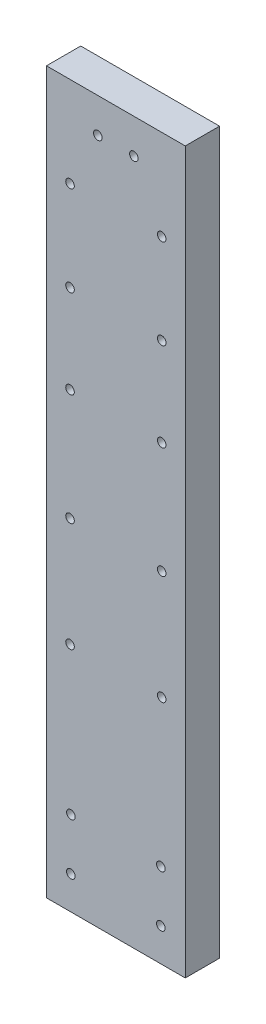
ISO-10303-21;
HEADER;
FILE_DESCRIPTION(('STEP AP214'),'2;1');
FILE_NAME('part.step','',(''),(''),'','','');
FILE_SCHEMA(('AUTOMOTIVE_DESIGN { 1 0 10303 214 1 1 1 1 }'));
ENDSEC;
DATA;
#1=APPLICATION_CONTEXT('core data for automotive mechanical design processes');
#2=APPLICATION_PROTOCOL_DEFINITION('international standard','automotive_design',2000,#1);
#3=PRODUCT_CONTEXT('',#1,'mechanical');
#4=PRODUCT('Part','Part','',(#3));
#5=PRODUCT_RELATED_PRODUCT_CATEGORY('part','',(#4));
#6=PRODUCT_DEFINITION_FORMATION('','',#4);
#7=PRODUCT_DEFINITION_CONTEXT('part definition',#1,'design');
#8=PRODUCT_DEFINITION('design','',#6,#7);
#9=PRODUCT_DEFINITION_SHAPE('','',#8);
#10=(LENGTH_UNIT() NAMED_UNIT(*) SI_UNIT(.MILLI.,.METRE.));
#11=(NAMED_UNIT(*) PLANE_ANGLE_UNIT() SI_UNIT($,.RADIAN.));
#12=(NAMED_UNIT(*) SI_UNIT($,.STERADIAN.) SOLID_ANGLE_UNIT());
#13=UNCERTAINTY_MEASURE_WITH_UNIT(LENGTH_MEASURE(1.E-05),#10,'distance_accuracy_value','');
#14=(GEOMETRIC_REPRESENTATION_CONTEXT(3) GLOBAL_UNCERTAINTY_ASSIGNED_CONTEXT((#13)) GLOBAL_UNIT_ASSIGNED_CONTEXT((#10,
#11,#12)) REPRESENTATION_CONTEXT('',''));
#15=CARTESIAN_POINT('',(0.,0.,0.));
#16=DIRECTION('',(0.,0.,1.));
#17=DIRECTION('',(1.,0.,0.));
#18=AXIS2_PLACEMENT_3D('',#15,#16,#17);
#19=CARTESIAN_POINT('',(0.,0.,4.));
#20=DIRECTION('',(0.,0.,-1.));
#21=DIRECTION('',(-1.,0.,0.));
#22=AXIS2_PLACEMENT_3D('',#19,#20,#21);
#23=PLANE('',#22);
#24=CARTESIAN_POINT('',(10.2000000000012,80.0650000000017,4.));
#25=DIRECTION('',(0.,0.,1.));
#26=DIRECTION('',(1.,0.,0.));
#27=AXIS2_PLACEMENT_3D('',#24,#25,#26);
#28=CIRCLE('',#27,0.499999999999999);
#29=CARTESIAN_POINT('',(10.7000000000012,80.0650000000017,4.));
#30=VERTEX_POINT('',#29);
#31=EDGE_CURVE('E192',#30,#30,#28,.T.);
#32=ORIENTED_EDGE('',*,*,#31,.F.);
#33=EDGE_LOOP('',(#32));
#34=FACE_BOUND('',#33,.T.);
#35=CARTESIAN_POINT('',(13.4500000000022,73.5649999999973,4.));
#36=DIRECTION('',(0.,0.,1.));
#37=DIRECTION('',(1.,0.,0.));
#38=AXIS2_PLACEMENT_3D('',#35,#36,#37);
#39=CIRCLE('',#38,0.500000000000006);
#40=CARTESIAN_POINT('',(13.9500000000022,73.5649999999973,4.));
#41=VERTEX_POINT('',#40);
#42=EDGE_CURVE('E180',#41,#41,#39,.T.);
#43=ORIENTED_EDGE('',*,*,#42,.F.);
#44=EDGE_LOOP('',(#43));
#45=FACE_BOUND('',#44,.T.);
#46=CARTESIAN_POINT('',(13.350000000001,3.84644883105539,4.));
#47=DIRECTION('',(0.,0.,1.));
#48=DIRECTION('',(-1.,0.,0.));
#49=AXIS2_PLACEMENT_3D('',#46,#47,#48);
#50=CIRCLE('',#49,0.499999999999999);
#51=CARTESIAN_POINT('',(12.850000000001,3.84644883105539,4.));
#52=VERTEX_POINT('',#51);
#53=EDGE_CURVE('E168',#52,#52,#50,.T.);
#54=ORIENTED_EDGE('',*,*,#53,.F.);
#55=EDGE_LOOP('',(#54));
#56=FACE_BOUND('',#55,.T.);
#57=CARTESIAN_POINT('',(2.85,3.84644883105539,4.));
#58=DIRECTION('',(0.,0.,1.));
#59=DIRECTION('',(1.,0.,0.));
#60=AXIS2_PLACEMENT_3D('',#57,#58,#59);
#61=CIRCLE('',#60,0.499999999999999);
#62=CARTESIAN_POINT('',(3.35,3.84644883105539,4.));
#63=VERTEX_POINT('',#62);
#64=EDGE_CURVE('E156',#63,#63,#61,.T.);
#65=ORIENTED_EDGE('',*,*,#64,.F.);
#66=EDGE_LOOP('',(#65));
#67=FACE_BOUND('',#66,.T.);
#68=CARTESIAN_POINT('',(13.4500000000001,63.064999999999,4.));
#69=DIRECTION('',(0.,0.,1.));
#70=DIRECTION('',(1.,0.,0.));
#71=AXIS2_PLACEMENT_3D('',#68,#69,#70);
#72=CIRCLE('',#71,0.500000000000006);
#73=CARTESIAN_POINT('',(13.9500000000001,63.064999999999,4.));
#74=VERTEX_POINT('',#73);
#75=EDGE_CURVE('E144',#74,#74,#72,.T.);
#76=ORIENTED_EDGE('',*,*,#75,.F.);
#77=EDGE_LOOP('',(#76));
#78=FACE_BOUND('',#77,.T.);
#79=CARTESIAN_POINT('',(13.4500000000017,52.739999999999,4.));
#80=DIRECTION('',(0.,0.,1.));
#81=DIRECTION('',(1.,0.,0.));
#82=AXIS2_PLACEMENT_3D('',#79,#80,#81);
#83=CIRCLE('',#82,0.499999999999999);
#84=CARTESIAN_POINT('',(13.9500000000017,52.739999999999,4.));
#85=VERTEX_POINT('',#84);
#86=EDGE_CURVE('E132',#85,#85,#83,.T.);
#87=ORIENTED_EDGE('',*,*,#86,.F.);
#88=EDGE_LOOP('',(#87));
#89=FACE_BOUND('',#88,.T.);
#90=CARTESIAN_POINT('',(13.4500000000001,39.7399999999992,4.));
#91=DIRECTION('',(0.,0.,1.));
#92=DIRECTION('',(1.,0.,0.));
#93=AXIS2_PLACEMENT_3D('',#90,#91,#92);
#94=CIRCLE('',#93,0.499999999999999);
#95=CARTESIAN_POINT('',(13.9500000000001,39.7399999999992,4.));
#96=VERTEX_POINT('',#95);
#97=EDGE_CURVE('E120',#96,#96,#94,.T.);
#98=ORIENTED_EDGE('',*,*,#97,.F.);
#99=EDGE_LOOP('',(#98));
#100=FACE_BOUND('',#99,.T.);
#101=CARTESIAN_POINT('',(13.4500000000001,27.0000000000002,4.));
#102=DIRECTION('',(0.,0.,1.));
#103=DIRECTION('',(1.,0.,0.));
#104=AXIS2_PLACEMENT_3D('',#101,#102,#103);
#105=CIRCLE('',#104,0.499999999999999);
#106=CARTESIAN_POINT('',(13.9500000000001,27.0000000000002,4.));
#107=VERTEX_POINT('',#106);
#108=EDGE_CURVE('E99',#107,#107,#105,.T.);
#109=ORIENTED_EDGE('',*,*,#108,.F.);
#110=EDGE_LOOP('',(#109));
#111=FACE_BOUND('',#110,.T.);
#112=DIRECTION('',(-1.,0.,0.));
#113=VECTOR('',#112,1.);
#114=CARTESIAN_POINT('',(16.2000000000021,84.1,4.));
#115=LINE('',#114,#113);
#116=CARTESIAN_POINT('',(16.2000000000021,84.1,4.));
#117=VERTEX_POINT('',#116);
#118=CARTESIAN_POINT('',(0.,84.1,4.));
#119=VERTEX_POINT('',#118);
#120=EDGE_CURVE('E84',#117,#119,#115,.T.);
#121=ORIENTED_EDGE('',*,*,#120,.T.);
#122=DIRECTION('',(0.,-1.,0.));
#123=VECTOR('',#122,1.);
#124=CARTESIAN_POINT('',(0.,0.,4.));
#125=LINE('',#124,#123);
#126=CARTESIAN_POINT('',(0.,0.,4.));
#127=VERTEX_POINT('',#126);
#128=EDGE_CURVE('E79',#119,#127,#125,.T.);
#129=ORIENTED_EDGE('',*,*,#128,.T.);
#130=DIRECTION('',(1.,0.,0.));
#131=VECTOR('',#130,1.);
#132=CARTESIAN_POINT('',(0.,0.,4.));
#133=LINE('',#132,#131);
#134=CARTESIAN_POINT('',(16.2000000000021,0.,4.));
#135=VERTEX_POINT('',#134);
#136=EDGE_CURVE('E82',#127,#135,#133,.T.);
#137=ORIENTED_EDGE('',*,*,#136,.T.);
#138=DIRECTION('',(0.,1.,0.));
#139=VECTOR('',#138,1.);
#140=CARTESIAN_POINT('',(16.2000000000021,0.,4.));
#141=LINE('',#140,#139);
#142=EDGE_CURVE('E49',#135,#117,#141,.T.);
#143=ORIENTED_EDGE('',*,*,#142,.T.);
#144=EDGE_LOOP('',(#121,#129,#137,#143));
#145=FACE_BOUND('',#144,.T.);
#146=CARTESIAN_POINT('',(2.75000000000004,27.0000000000004,4.));
#147=DIRECTION('',(0.,0.,1.));
#148=DIRECTION('',(1.,0.,0.));
#149=AXIS2_PLACEMENT_3D('',#146,#147,#148);
#150=CIRCLE('',#149,0.499999999999999);
#151=CARTESIAN_POINT('',(3.25000000000004,27.0000000000004,4.));
#152=VERTEX_POINT('',#151);
#153=EDGE_CURVE('E114',#152,#152,#150,.T.);
#154=ORIENTED_EDGE('',*,*,#153,.F.);
#155=EDGE_LOOP('',(#154));
#156=FACE_BOUND('',#155,.T.);
#157=CARTESIAN_POINT('',(2.75000000000003,39.7399999999994,4.));
#158=DIRECTION('',(0.,0.,1.));
#159=DIRECTION('',(1.,0.,0.));
#160=AXIS2_PLACEMENT_3D('',#157,#158,#159);
#161=CIRCLE('',#160,0.499999999999999);
#162=CARTESIAN_POINT('',(3.25000000000003,39.7399999999994,4.));
#163=VERTEX_POINT('',#162);
#164=EDGE_CURVE('E126',#163,#163,#161,.T.);
#165=ORIENTED_EDGE('',*,*,#164,.F.);
#166=EDGE_LOOP('',(#165));
#167=FACE_BOUND('',#166,.T.);
#168=CARTESIAN_POINT('',(2.75000000000138,52.7399999999993,4.));
#169=DIRECTION('',(0.,0.,1.));
#170=DIRECTION('',(1.,0.,0.));
#171=AXIS2_PLACEMENT_3D('',#168,#169,#170);
#172=CIRCLE('',#171,0.499999999999999);
#173=CARTESIAN_POINT('',(3.25000000000138,52.7399999999993,4.));
#174=VERTEX_POINT('',#173);
#175=EDGE_CURVE('E138',#174,#174,#172,.T.);
#176=ORIENTED_EDGE('',*,*,#175,.F.);
#177=EDGE_LOOP('',(#176));
#178=FACE_BOUND('',#177,.T.);
#179=CARTESIAN_POINT('',(2.85,9.84644883105539,4.));
#180=DIRECTION('',(0.,0.,1.));
#181=DIRECTION('',(1.,0.,0.));
#182=AXIS2_PLACEMENT_3D('',#179,#180,#181);
#183=CIRCLE('',#182,0.499999999999999);
#184=CARTESIAN_POINT('',(3.35,9.84644883105539,4.));
#185=VERTEX_POINT('',#184);
#186=EDGE_CURVE('E150',#185,#185,#183,.T.);
#187=ORIENTED_EDGE('',*,*,#186,.F.);
#188=EDGE_LOOP('',(#187));
#189=FACE_BOUND('',#188,.T.);
#190=CARTESIAN_POINT('',(13.350000000001,9.84644883105539,4.));
#191=DIRECTION('',(0.,0.,1.));
#192=DIRECTION('',(-1.,0.,0.));
#193=AXIS2_PLACEMENT_3D('',#190,#191,#192);
#194=CIRCLE('',#193,0.499999999999999);
#195=CARTESIAN_POINT('',(12.850000000001,9.84644883105539,4.));
#196=VERTEX_POINT('',#195);
#197=EDGE_CURVE('E162',#196,#196,#194,.T.);
#198=ORIENTED_EDGE('',*,*,#197,.F.);
#199=EDGE_LOOP('',(#198));
#200=FACE_BOUND('',#199,.T.);
#201=CARTESIAN_POINT('',(2.75000000000004,63.0649999999993,4.));
#202=DIRECTION('',(0.,0.,1.));
#203=DIRECTION('',(1.,0.,0.));
#204=AXIS2_PLACEMENT_3D('',#201,#202,#203);
#205=CIRCLE('',#204,0.499999999999999);
#206=CARTESIAN_POINT('',(3.25000000000004,63.0649999999993,4.));
#207=VERTEX_POINT('',#206);
#208=EDGE_CURVE('E174',#207,#207,#205,.T.);
#209=ORIENTED_EDGE('',*,*,#208,.F.);
#210=EDGE_LOOP('',(#209));
#211=FACE_BOUND('',#210,.T.);
#212=CARTESIAN_POINT('',(2.75000000000093,73.5649999999997,4.));
#213=DIRECTION('',(0.,0.,1.));
#214=DIRECTION('',(1.,0.,0.));
#215=AXIS2_PLACEMENT_3D('',#212,#213,#214);
#216=CIRCLE('',#215,0.499999999999999);
#217=CARTESIAN_POINT('',(3.25000000000093,73.5649999999997,4.));
#218=VERTEX_POINT('',#217);
#219=EDGE_CURVE('E186',#218,#218,#216,.T.);
#220=ORIENTED_EDGE('',*,*,#219,.F.);
#221=EDGE_LOOP('',(#220));
#222=FACE_BOUND('',#221,.T.);
#223=CARTESIAN_POINT('',(6.00000000000112,80.0650000000017,4.));
#224=DIRECTION('',(0.,0.,1.));
#225=DIRECTION('',(1.,0.,0.));
#226=AXIS2_PLACEMENT_3D('',#223,#224,#225);
#227=CIRCLE('',#226,0.499999999999999);
#228=CARTESIAN_POINT('',(6.50000000000111,80.0650000000017,4.));
#229=VERTEX_POINT('',#228);
#230=EDGE_CURVE('E198',#229,#229,#227,.T.);
#231=ORIENTED_EDGE('',*,*,#230,.F.);
#232=EDGE_LOOP('',(#231));
#233=FACE_BOUND('',#232,.T.);
#234=ADVANCED_FACE('F32',(#34,#45,#56,#67,#78,#89,#100,#111,#145,#156,#167,#178,#189,#200,#211,
#222,#233),#23,.F.);
#235=CARTESIAN_POINT('',(0.,0.,0.));
#236=DIRECTION('',(0.,0.,-1.));
#237=DIRECTION('',(-1.,0.,0.));
#238=AXIS2_PLACEMENT_3D('',#235,#236,#237);
#239=PLANE('',#238);
#240=CARTESIAN_POINT('',(10.2000000000012,80.0650000000017,0.));
#241=DIRECTION('',(0.,0.,1.));
#242=DIRECTION('',(1.,0.,0.));
#243=AXIS2_PLACEMENT_3D('',#240,#241,#242);
#244=CIRCLE('',#243,0.499999999999999);
#245=CARTESIAN_POINT('',(10.7000000000012,80.0650000000017,0.));
#246=VERTEX_POINT('',#245);
#247=EDGE_CURVE('E195',#246,#246,#244,.T.);
#248=ORIENTED_EDGE('',*,*,#247,.T.);
#249=EDGE_LOOP('',(#248));
#250=FACE_BOUND('',#249,.T.);
#251=CARTESIAN_POINT('',(13.4500000000022,73.5649999999973,0.));
#252=DIRECTION('',(0.,0.,1.));
#253=DIRECTION('',(1.,0.,0.));
#254=AXIS2_PLACEMENT_3D('',#251,#252,#253);
#255=CIRCLE('',#254,0.500000000000006);
#256=CARTESIAN_POINT('',(13.9500000000022,73.5649999999973,0.));
#257=VERTEX_POINT('',#256);
#258=EDGE_CURVE('E183',#257,#257,#255,.T.);
#259=ORIENTED_EDGE('',*,*,#258,.T.);
#260=EDGE_LOOP('',(#259));
#261=FACE_BOUND('',#260,.T.);
#262=CARTESIAN_POINT('',(13.350000000001,3.84644883105539,0.));
#263=DIRECTION('',(0.,0.,1.));
#264=DIRECTION('',(-1.,0.,0.));
#265=AXIS2_PLACEMENT_3D('',#262,#263,#264);
#266=CIRCLE('',#265,0.499999999999999);
#267=CARTESIAN_POINT('',(12.850000000001,3.84644883105539,0.));
#268=VERTEX_POINT('',#267);
#269=EDGE_CURVE('E171',#268,#268,#266,.T.);
#270=ORIENTED_EDGE('',*,*,#269,.T.);
#271=EDGE_LOOP('',(#270));
#272=FACE_BOUND('',#271,.T.);
#273=CARTESIAN_POINT('',(2.85,3.84644883105539,0.));
#274=DIRECTION('',(0.,0.,1.));
#275=DIRECTION('',(1.,0.,0.));
#276=AXIS2_PLACEMENT_3D('',#273,#274,#275);
#277=CIRCLE('',#276,0.499999999999999);
#278=CARTESIAN_POINT('',(3.35,3.84644883105539,0.));
#279=VERTEX_POINT('',#278);
#280=EDGE_CURVE('E159',#279,#279,#277,.T.);
#281=ORIENTED_EDGE('',*,*,#280,.T.);
#282=EDGE_LOOP('',(#281));
#283=FACE_BOUND('',#282,.T.);
#284=CARTESIAN_POINT('',(13.4500000000001,63.064999999999,0.));
#285=DIRECTION('',(0.,0.,1.));
#286=DIRECTION('',(1.,0.,0.));
#287=AXIS2_PLACEMENT_3D('',#284,#285,#286);
#288=CIRCLE('',#287,0.500000000000006);
#289=CARTESIAN_POINT('',(13.9500000000001,63.064999999999,0.));
#290=VERTEX_POINT('',#289);
#291=EDGE_CURVE('E147',#290,#290,#288,.T.);
#292=ORIENTED_EDGE('',*,*,#291,.T.);
#293=EDGE_LOOP('',(#292));
#294=FACE_BOUND('',#293,.T.);
#295=CARTESIAN_POINT('',(13.4500000000017,52.739999999999,0.));
#296=DIRECTION('',(0.,0.,1.));
#297=DIRECTION('',(1.,0.,0.));
#298=AXIS2_PLACEMENT_3D('',#295,#296,#297);
#299=CIRCLE('',#298,0.499999999999999);
#300=CARTESIAN_POINT('',(13.9500000000017,52.739999999999,0.));
#301=VERTEX_POINT('',#300);
#302=EDGE_CURVE('E135',#301,#301,#299,.T.);
#303=ORIENTED_EDGE('',*,*,#302,.T.);
#304=EDGE_LOOP('',(#303));
#305=FACE_BOUND('',#304,.T.);
#306=CARTESIAN_POINT('',(13.4500000000001,39.7399999999992,0.));
#307=DIRECTION('',(0.,0.,1.));
#308=DIRECTION('',(1.,0.,0.));
#309=AXIS2_PLACEMENT_3D('',#306,#307,#308);
#310=CIRCLE('',#309,0.499999999999999);
#311=CARTESIAN_POINT('',(13.9500000000001,39.7399999999992,0.));
#312=VERTEX_POINT('',#311);
#313=EDGE_CURVE('E123',#312,#312,#310,.T.);
#314=ORIENTED_EDGE('',*,*,#313,.T.);
#315=EDGE_LOOP('',(#314));
#316=FACE_BOUND('',#315,.T.);
#317=CARTESIAN_POINT('',(13.4500000000001,27.0000000000002,0.));
#318=DIRECTION('',(0.,0.,1.));
#319=DIRECTION('',(1.,0.,0.));
#320=AXIS2_PLACEMENT_3D('',#317,#318,#319);
#321=CIRCLE('',#320,0.499999999999999);
#322=CARTESIAN_POINT('',(13.9500000000001,27.0000000000002,0.));
#323=VERTEX_POINT('',#322);
#324=EDGE_CURVE('E111',#323,#323,#321,.T.);
#325=ORIENTED_EDGE('',*,*,#324,.T.);
#326=EDGE_LOOP('',(#325));
#327=FACE_BOUND('',#326,.T.);
#328=DIRECTION('',(-1.,0.,0.));
#329=VECTOR('',#328,1.);
#330=CARTESIAN_POINT('',(16.2000000000021,84.1,0.));
#331=LINE('',#330,#329);
#332=CARTESIAN_POINT('',(16.2000000000021,84.1,0.));
#333=VERTEX_POINT('',#332);
#334=CARTESIAN_POINT('',(0.,84.1,0.));
#335=VERTEX_POINT('',#334);
#336=EDGE_CURVE('E96',#333,#335,#331,.T.);
#337=ORIENTED_EDGE('',*,*,#336,.F.);
#338=DIRECTION('',(0.,1.,0.));
#339=VECTOR('',#338,1.);
#340=CARTESIAN_POINT('',(16.2000000000021,0.,0.));
#341=LINE('',#340,#339);
#342=CARTESIAN_POINT('',(16.2000000000021,0.,0.));
#343=VERTEX_POINT('',#342);
#344=EDGE_CURVE('E72',#343,#333,#341,.T.);
#345=ORIENTED_EDGE('',*,*,#344,.F.);
#346=DIRECTION('',(1.,0.,0.));
#347=VECTOR('',#346,1.);
#348=CARTESIAN_POINT('',(0.,0.,0.));
#349=LINE('',#348,#347);
#350=CARTESIAN_POINT('',(0.,0.,0.));
#351=VERTEX_POINT('',#350);
#352=EDGE_CURVE('E66',#351,#343,#349,.T.);
#353=ORIENTED_EDGE('',*,*,#352,.F.);
#354=DIRECTION('',(0.,-1.,0.));
#355=VECTOR('',#354,1.);
#356=CARTESIAN_POINT('',(0.,0.,0.));
#357=LINE('',#356,#355);
#358=EDGE_CURVE('E88',#335,#351,#357,.T.);
#359=ORIENTED_EDGE('',*,*,#358,.F.);
#360=EDGE_LOOP('',(#337,#345,#353,#359));
#361=FACE_BOUND('',#360,.T.);
#362=CARTESIAN_POINT('',(2.75000000000004,27.0000000000004,0.));
#363=DIRECTION('',(0.,0.,1.));
#364=DIRECTION('',(1.,0.,0.));
#365=AXIS2_PLACEMENT_3D('',#362,#363,#364);
#366=CIRCLE('',#365,0.499999999999999);
#367=CARTESIAN_POINT('',(3.25000000000004,27.0000000000004,0.));
#368=VERTEX_POINT('',#367);
#369=EDGE_CURVE('E117',#368,#368,#366,.T.);
#370=ORIENTED_EDGE('',*,*,#369,.T.);
#371=EDGE_LOOP('',(#370));
#372=FACE_BOUND('',#371,.T.);
#373=CARTESIAN_POINT('',(2.75000000000003,39.7399999999994,0.));
#374=DIRECTION('',(0.,0.,1.));
#375=DIRECTION('',(1.,0.,0.));
#376=AXIS2_PLACEMENT_3D('',#373,#374,#375);
#377=CIRCLE('',#376,0.499999999999999);
#378=CARTESIAN_POINT('',(3.25000000000003,39.7399999999994,0.));
#379=VERTEX_POINT('',#378);
#380=EDGE_CURVE('E129',#379,#379,#377,.T.);
#381=ORIENTED_EDGE('',*,*,#380,.T.);
#382=EDGE_LOOP('',(#381));
#383=FACE_BOUND('',#382,.T.);
#384=CARTESIAN_POINT('',(2.75000000000138,52.7399999999993,0.));
#385=DIRECTION('',(0.,0.,1.));
#386=DIRECTION('',(1.,0.,0.));
#387=AXIS2_PLACEMENT_3D('',#384,#385,#386);
#388=CIRCLE('',#387,0.499999999999999);
#389=CARTESIAN_POINT('',(3.25000000000138,52.7399999999993,0.));
#390=VERTEX_POINT('',#389);
#391=EDGE_CURVE('E141',#390,#390,#388,.T.);
#392=ORIENTED_EDGE('',*,*,#391,.T.);
#393=EDGE_LOOP('',(#392));
#394=FACE_BOUND('',#393,.T.);
#395=CARTESIAN_POINT('',(2.85,9.84644883105539,0.));
#396=DIRECTION('',(0.,0.,1.));
#397=DIRECTION('',(1.,0.,0.));
#398=AXIS2_PLACEMENT_3D('',#395,#396,#397);
#399=CIRCLE('',#398,0.499999999999999);
#400=CARTESIAN_POINT('',(3.35,9.84644883105539,0.));
#401=VERTEX_POINT('',#400);
#402=EDGE_CURVE('E153',#401,#401,#399,.T.);
#403=ORIENTED_EDGE('',*,*,#402,.T.);
#404=EDGE_LOOP('',(#403));
#405=FACE_BOUND('',#404,.T.);
#406=CARTESIAN_POINT('',(13.350000000001,9.84644883105539,0.));
#407=DIRECTION('',(0.,0.,1.));
#408=DIRECTION('',(-1.,0.,0.));
#409=AXIS2_PLACEMENT_3D('',#406,#407,#408);
#410=CIRCLE('',#409,0.499999999999999);
#411=CARTESIAN_POINT('',(12.850000000001,9.84644883105539,0.));
#412=VERTEX_POINT('',#411);
#413=EDGE_CURVE('E165',#412,#412,#410,.T.);
#414=ORIENTED_EDGE('',*,*,#413,.T.);
#415=EDGE_LOOP('',(#414));
#416=FACE_BOUND('',#415,.T.);
#417=CARTESIAN_POINT('',(2.75000000000004,63.0649999999993,0.));
#418=DIRECTION('',(0.,0.,1.));
#419=DIRECTION('',(1.,0.,0.));
#420=AXIS2_PLACEMENT_3D('',#417,#418,#419);
#421=CIRCLE('',#420,0.499999999999999);
#422=CARTESIAN_POINT('',(3.25000000000004,63.0649999999993,0.));
#423=VERTEX_POINT('',#422);
#424=EDGE_CURVE('E177',#423,#423,#421,.T.);
#425=ORIENTED_EDGE('',*,*,#424,.T.);
#426=EDGE_LOOP('',(#425));
#427=FACE_BOUND('',#426,.T.);
#428=CARTESIAN_POINT('',(2.75000000000093,73.5649999999997,0.));
#429=DIRECTION('',(0.,0.,1.));
#430=DIRECTION('',(1.,0.,0.));
#431=AXIS2_PLACEMENT_3D('',#428,#429,#430);
#432=CIRCLE('',#431,0.499999999999999);
#433=CARTESIAN_POINT('',(3.25000000000093,73.5649999999997,0.));
#434=VERTEX_POINT('',#433);
#435=EDGE_CURVE('E189',#434,#434,#432,.T.);
#436=ORIENTED_EDGE('',*,*,#435,.T.);
#437=EDGE_LOOP('',(#436));
#438=FACE_BOUND('',#437,.T.);
#439=CARTESIAN_POINT('',(6.00000000000112,80.0650000000017,0.));
#440=DIRECTION('',(0.,0.,1.));
#441=DIRECTION('',(1.,0.,0.));
#442=AXIS2_PLACEMENT_3D('',#439,#440,#441);
#443=CIRCLE('',#442,0.499999999999999);
#444=CARTESIAN_POINT('',(6.50000000000111,80.0650000000017,0.));
#445=VERTEX_POINT('',#444);
#446=EDGE_CURVE('E201',#445,#445,#443,.T.);
#447=ORIENTED_EDGE('',*,*,#446,.T.);
#448=EDGE_LOOP('',(#447));
#449=FACE_BOUND('',#448,.T.);
#450=ADVANCED_FACE('F107',(#250,#261,#272,#283,#294,#305,#316,#327,#361,#372,#383,#394,#405,
#416,#427,#438,#449),#239,.T.);
#451=CARTESIAN_POINT('',(16.2000000000021,84.1,4.));
#452=DIRECTION('',(0.,-1.,0.));
#453=DIRECTION('',(0.,0.,-1.));
#454=AXIS2_PLACEMENT_3D('',#451,#452,#453);
#455=PLANE('',#454);
#456=ORIENTED_EDGE('',*,*,#336,.T.);
#457=DIRECTION('',(0.,0.,-1.));
#458=VECTOR('',#457,1.);
#459=CARTESIAN_POINT('',(0.,84.1,4.));
#460=LINE('',#459,#458);
#461=EDGE_CURVE('E11',#119,#335,#460,.T.);
#462=ORIENTED_EDGE('',*,*,#461,.F.);
#463=ORIENTED_EDGE('',*,*,#120,.F.);
#464=DIRECTION('',(0.,0.,-1.));
#465=VECTOR('',#464,1.);
#466=CARTESIAN_POINT('',(16.2000000000021,84.1,4.));
#467=LINE('',#466,#465);
#468=EDGE_CURVE('E92',#117,#333,#467,.T.);
#469=ORIENTED_EDGE('',*,*,#468,.T.);
#470=EDGE_LOOP('',(#456,#462,#463,#469));
#471=FACE_BOUND('',#470,.T.);
#472=ADVANCED_FACE('F34',(#471),#455,.F.);
#473=CARTESIAN_POINT('',(0.,0.,4.));
#474=DIRECTION('',(1.,0.,0.));
#475=DIRECTION('',(0.,0.,-1.));
#476=AXIS2_PLACEMENT_3D('',#473,#474,#475);
#477=PLANE('',#476);
#478=ORIENTED_EDGE('',*,*,#358,.T.);
#479=DIRECTION('',(0.,0.,-1.));
#480=VECTOR('',#479,1.);
#481=CARTESIAN_POINT('',(0.,0.,4.));
#482=LINE('',#481,#480);
#483=EDGE_CURVE('E41',#127,#351,#482,.T.);
#484=ORIENTED_EDGE('',*,*,#483,.F.);
#485=ORIENTED_EDGE('',*,*,#128,.F.);
#486=ORIENTED_EDGE('',*,*,#461,.T.);
#487=EDGE_LOOP('',(#478,#484,#485,#486));
#488=FACE_BOUND('',#487,.T.);
#489=ADVANCED_FACE('F87',(#488),#477,.F.);
#490=CARTESIAN_POINT('',(0.,0.,4.));
#491=DIRECTION('',(0.,1.,0.));
#492=DIRECTION('',(0.,0.,1.));
#493=AXIS2_PLACEMENT_3D('',#490,#491,#492);
#494=PLANE('',#493);
#495=ORIENTED_EDGE('',*,*,#352,.T.);
#496=DIRECTION('',(0.,0.,-1.));
#497=VECTOR('',#496,1.);
#498=CARTESIAN_POINT('',(16.2000000000021,0.,4.));
#499=LINE('',#498,#497);
#500=EDGE_CURVE('E89',#135,#343,#499,.T.);
#501=ORIENTED_EDGE('',*,*,#500,.F.);
#502=ORIENTED_EDGE('',*,*,#136,.F.);
#503=ORIENTED_EDGE('',*,*,#483,.T.);
#504=EDGE_LOOP('',(#495,#501,#502,#503));
#505=FACE_BOUND('',#504,.T.);
#506=ADVANCED_FACE('F90',(#505),#494,.F.);
#507=CARTESIAN_POINT('',(16.2000000000021,0.,4.));
#508=DIRECTION('',(-1.,0.,0.));
#509=DIRECTION('',(0.,0.,1.));
#510=AXIS2_PLACEMENT_3D('',#507,#508,#509);
#511=PLANE('',#510);
#512=ORIENTED_EDGE('',*,*,#344,.T.);
#513=ORIENTED_EDGE('',*,*,#468,.F.);
#514=ORIENTED_EDGE('',*,*,#142,.F.);
#515=ORIENTED_EDGE('',*,*,#500,.T.);
#516=EDGE_LOOP('',(#512,#513,#514,#515));
#517=FACE_BOUND('',#516,.T.);
#518=ADVANCED_FACE('F104',(#517),#511,.F.);
#519=CARTESIAN_POINT('',(13.4500000000001,27.0000000000002,4.));
#520=DIRECTION('',(0.,0.,-1.));
#521=DIRECTION('',(-1.,0.,0.));
#522=AXIS2_PLACEMENT_3D('',#519,#520,#521);
#523=CYLINDRICAL_SURFACE('',#522,0.499999999999999);
#524=ORIENTED_EDGE('',*,*,#108,.T.);
#525=EDGE_LOOP('',(#524));
#526=FACE_BOUND('',#525,.T.);
#527=ORIENTED_EDGE('',*,*,#324,.F.);
#528=EDGE_LOOP('',(#527));
#529=FACE_BOUND('',#528,.T.);
#530=ADVANCED_FACE('F221',(#526,#529),#523,.F.);
#531=CARTESIAN_POINT('',(2.75000000000004,27.0000000000004,4.));
#532=DIRECTION('',(0.,0.,-1.));
#533=DIRECTION('',(-1.,0.,0.));
#534=AXIS2_PLACEMENT_3D('',#531,#532,#533);
#535=CYLINDRICAL_SURFACE('',#534,0.499999999999999);
#536=ORIENTED_EDGE('',*,*,#153,.T.);
#537=EDGE_LOOP('',(#536));
#538=FACE_BOUND('',#537,.T.);
#539=ORIENTED_EDGE('',*,*,#369,.F.);
#540=EDGE_LOOP('',(#539));
#541=FACE_BOUND('',#540,.T.);
#542=ADVANCED_FACE('F267',(#538,#541),#535,.F.);
#543=CARTESIAN_POINT('',(13.4500000000001,39.7399999999992,4.));
#544=DIRECTION('',(0.,0.,-1.));
#545=DIRECTION('',(-1.,0.,0.));
#546=AXIS2_PLACEMENT_3D('',#543,#544,#545);
#547=CYLINDRICAL_SURFACE('',#546,0.499999999999999);
#548=ORIENTED_EDGE('',*,*,#97,.T.);
#549=EDGE_LOOP('',(#548));
#550=FACE_BOUND('',#549,.T.);
#551=ORIENTED_EDGE('',*,*,#313,.F.);
#552=EDGE_LOOP('',(#551));
#553=FACE_BOUND('',#552,.T.);
#554=ADVANCED_FACE('F275',(#550,#553),#547,.F.);
#555=CARTESIAN_POINT('',(2.75000000000003,39.7399999999994,4.));
#556=DIRECTION('',(0.,0.,-1.));
#557=DIRECTION('',(-1.,0.,0.));
#558=AXIS2_PLACEMENT_3D('',#555,#556,#557);
#559=CYLINDRICAL_SURFACE('',#558,0.499999999999999);
#560=ORIENTED_EDGE('',*,*,#164,.T.);
#561=EDGE_LOOP('',(#560));
#562=FACE_BOUND('',#561,.T.);
#563=ORIENTED_EDGE('',*,*,#380,.F.);
#564=EDGE_LOOP('',(#563));
#565=FACE_BOUND('',#564,.T.);
#566=ADVANCED_FACE('F283',(#562,#565),#559,.F.);
#567=CARTESIAN_POINT('',(13.4500000000017,52.739999999999,4.));
#568=DIRECTION('',(0.,0.,-1.));
#569=DIRECTION('',(-1.,0.,0.));
#570=AXIS2_PLACEMENT_3D('',#567,#568,#569);
#571=CYLINDRICAL_SURFACE('',#570,0.499999999999999);
#572=ORIENTED_EDGE('',*,*,#86,.T.);
#573=EDGE_LOOP('',(#572));
#574=FACE_BOUND('',#573,.T.);
#575=ORIENTED_EDGE('',*,*,#302,.F.);
#576=EDGE_LOOP('',(#575));
#577=FACE_BOUND('',#576,.T.);
#578=ADVANCED_FACE('F292',(#574,#577),#571,.F.);
#579=CARTESIAN_POINT('',(2.75000000000138,52.7399999999993,4.));
#580=DIRECTION('',(0.,0.,-1.));
#581=DIRECTION('',(-1.,0.,0.));
#582=AXIS2_PLACEMENT_3D('',#579,#580,#581);
#583=CYLINDRICAL_SURFACE('',#582,0.499999999999999);
#584=ORIENTED_EDGE('',*,*,#175,.T.);
#585=EDGE_LOOP('',(#584));
#586=FACE_BOUND('',#585,.T.);
#587=ORIENTED_EDGE('',*,*,#391,.F.);
#588=EDGE_LOOP('',(#587));
#589=FACE_BOUND('',#588,.T.);
#590=ADVANCED_FACE('F301',(#586,#589),#583,.F.);
#591=CARTESIAN_POINT('',(13.4500000000001,63.064999999999,4.));
#592=DIRECTION('',(0.,0.,-1.));
#593=DIRECTION('',(-1.,0.,0.));
#594=AXIS2_PLACEMENT_3D('',#591,#592,#593);
#595=CYLINDRICAL_SURFACE('',#594,0.500000000000006);
#596=ORIENTED_EDGE('',*,*,#75,.T.);
#597=EDGE_LOOP('',(#596));
#598=FACE_BOUND('',#597,.T.);
#599=ORIENTED_EDGE('',*,*,#291,.F.);
#600=EDGE_LOOP('',(#599));
#601=FACE_BOUND('',#600,.T.);
#602=ADVANCED_FACE('F310',(#598,#601),#595,.F.);
#603=CARTESIAN_POINT('',(2.85,9.84644883105539,4.));
#604=DIRECTION('',(0.,0.,-1.));
#605=DIRECTION('',(-1.,0.,0.));
#606=AXIS2_PLACEMENT_3D('',#603,#604,#605);
#607=CYLINDRICAL_SURFACE('',#606,0.499999999999999);
#608=ORIENTED_EDGE('',*,*,#186,.T.);
#609=EDGE_LOOP('',(#608));
#610=FACE_BOUND('',#609,.T.);
#611=ORIENTED_EDGE('',*,*,#402,.F.);
#612=EDGE_LOOP('',(#611));
#613=FACE_BOUND('',#612,.T.);
#614=ADVANCED_FACE('F319',(#610,#613),#607,.F.);
#615=CARTESIAN_POINT('',(2.85,3.84644883105539,4.));
#616=DIRECTION('',(0.,0.,-1.));
#617=DIRECTION('',(-1.,0.,0.));
#618=AXIS2_PLACEMENT_3D('',#615,#616,#617);
#619=CYLINDRICAL_SURFACE('',#618,0.499999999999999);
#620=ORIENTED_EDGE('',*,*,#64,.T.);
#621=EDGE_LOOP('',(#620));
#622=FACE_BOUND('',#621,.T.);
#623=ORIENTED_EDGE('',*,*,#280,.F.);
#624=EDGE_LOOP('',(#623));
#625=FACE_BOUND('',#624,.T.);
#626=ADVANCED_FACE('F328',(#622,#625),#619,.F.);
#627=CARTESIAN_POINT('',(13.350000000001,9.84644883105539,4.));
#628=DIRECTION('',(0.,0.,-1.));
#629=DIRECTION('',(-1.,0.,0.));
#630=AXIS2_PLACEMENT_3D('',#627,#628,#629);
#631=CYLINDRICAL_SURFACE('',#630,0.499999999999999);
#632=ORIENTED_EDGE('',*,*,#197,.T.);
#633=EDGE_LOOP('',(#632));
#634=FACE_BOUND('',#633,.T.);
#635=ORIENTED_EDGE('',*,*,#413,.F.);
#636=EDGE_LOOP('',(#635));
#637=FACE_BOUND('',#636,.T.);
#638=ADVANCED_FACE('F337',(#634,#637),#631,.F.);
#639=CARTESIAN_POINT('',(13.350000000001,3.84644883105539,4.));
#640=DIRECTION('',(0.,0.,-1.));
#641=DIRECTION('',(-1.,0.,0.));
#642=AXIS2_PLACEMENT_3D('',#639,#640,#641);
#643=CYLINDRICAL_SURFACE('',#642,0.499999999999999);
#644=ORIENTED_EDGE('',*,*,#53,.T.);
#645=EDGE_LOOP('',(#644));
#646=FACE_BOUND('',#645,.T.);
#647=ORIENTED_EDGE('',*,*,#269,.F.);
#648=EDGE_LOOP('',(#647));
#649=FACE_BOUND('',#648,.T.);
#650=ADVANCED_FACE('F346',(#646,#649),#643,.F.);
#651=CARTESIAN_POINT('',(2.75000000000004,63.0649999999993,4.));
#652=DIRECTION('',(0.,0.,-1.));
#653=DIRECTION('',(-1.,0.,0.));
#654=AXIS2_PLACEMENT_3D('',#651,#652,#653);
#655=CYLINDRICAL_SURFACE('',#654,0.499999999999999);
#656=ORIENTED_EDGE('',*,*,#208,.T.);
#657=EDGE_LOOP('',(#656));
#658=FACE_BOUND('',#657,.T.);
#659=ORIENTED_EDGE('',*,*,#424,.F.);
#660=EDGE_LOOP('',(#659));
#661=FACE_BOUND('',#660,.T.);
#662=ADVANCED_FACE('F355',(#658,#661),#655,.F.);
#663=CARTESIAN_POINT('',(13.4500000000022,73.5649999999973,4.));
#664=DIRECTION('',(0.,0.,-1.));
#665=DIRECTION('',(-1.,0.,0.));
#666=AXIS2_PLACEMENT_3D('',#663,#664,#665);
#667=CYLINDRICAL_SURFACE('',#666,0.500000000000006);
#668=ORIENTED_EDGE('',*,*,#42,.T.);
#669=EDGE_LOOP('',(#668));
#670=FACE_BOUND('',#669,.T.);
#671=ORIENTED_EDGE('',*,*,#258,.F.);
#672=EDGE_LOOP('',(#671));
#673=FACE_BOUND('',#672,.T.);
#674=ADVANCED_FACE('F364',(#670,#673),#667,.F.);
#675=CARTESIAN_POINT('',(2.75000000000093,73.5649999999997,4.));
#676=DIRECTION('',(0.,0.,-1.));
#677=DIRECTION('',(-1.,0.,0.));
#678=AXIS2_PLACEMENT_3D('',#675,#676,#677);
#679=CYLINDRICAL_SURFACE('',#678,0.499999999999999);
#680=ORIENTED_EDGE('',*,*,#219,.T.);
#681=EDGE_LOOP('',(#680));
#682=FACE_BOUND('',#681,.T.);
#683=ORIENTED_EDGE('',*,*,#435,.F.);
#684=EDGE_LOOP('',(#683));
#685=FACE_BOUND('',#684,.T.);
#686=ADVANCED_FACE('F373',(#682,#685),#679,.F.);
#687=CARTESIAN_POINT('',(10.2000000000012,80.0650000000017,4.));
#688=DIRECTION('',(0.,0.,-1.));
#689=DIRECTION('',(-1.,0.,0.));
#690=AXIS2_PLACEMENT_3D('',#687,#688,#689);
#691=CYLINDRICAL_SURFACE('',#690,0.499999999999999);
#692=ORIENTED_EDGE('',*,*,#31,.T.);
#693=EDGE_LOOP('',(#692));
#694=FACE_BOUND('',#693,.T.);
#695=ORIENTED_EDGE('',*,*,#247,.F.);
#696=EDGE_LOOP('',(#695));
#697=FACE_BOUND('',#696,.T.);
#698=ADVANCED_FACE('F382',(#694,#697),#691,.F.);
#699=CARTESIAN_POINT('',(6.00000000000112,80.0650000000017,4.));
#700=DIRECTION('',(0.,0.,-1.));
#701=DIRECTION('',(-1.,0.,0.));
#702=AXIS2_PLACEMENT_3D('',#699,#700,#701);
#703=CYLINDRICAL_SURFACE('',#702,0.499999999999999);
#704=ORIENTED_EDGE('',*,*,#230,.T.);
#705=EDGE_LOOP('',(#704));
#706=FACE_BOUND('',#705,.T.);
#707=ORIENTED_EDGE('',*,*,#446,.F.);
#708=EDGE_LOOP('',(#707));
#709=FACE_BOUND('',#708,.T.);
#710=ADVANCED_FACE('F207',(#706,#709),#703,.F.);
#711=CLOSED_SHELL('',(#234,#450,#472,#489,#506,#518,#530,#542,#554,#566,#578,#590,#602,#614,
#626,#638,#650,#662,#674,#686,#698,#710));
#712=MANIFOLD_SOLID_BREP('B2',#711);
#713=ADVANCED_BREP_SHAPE_REPRESENTATION('',(#18,#712),#14);
#714=SHAPE_DEFINITION_REPRESENTATION(#9,#713);
ENDSEC;
END-ISO-10303-21;
